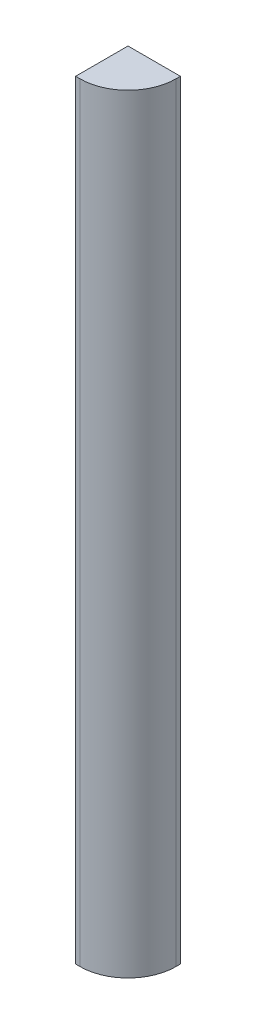
ISO-10303-21;
HEADER;
FILE_DESCRIPTION(('STEP AP214'),'2;1');
FILE_NAME('part.step','',(''),(''),'','','');
FILE_SCHEMA(('AUTOMOTIVE_DESIGN { 1 0 10303 214 1 1 1 1 }'));
ENDSEC;
DATA;
#1=APPLICATION_CONTEXT('core data for automotive mechanical design processes');
#2=APPLICATION_PROTOCOL_DEFINITION('international standard','automotive_design',2000,#1);
#3=PRODUCT_CONTEXT('',#1,'mechanical');
#4=PRODUCT('Part','Part','',(#3));
#5=PRODUCT_RELATED_PRODUCT_CATEGORY('part','',(#4));
#6=PRODUCT_DEFINITION_FORMATION('','',#4);
#7=PRODUCT_DEFINITION_CONTEXT('part definition',#1,'design');
#8=PRODUCT_DEFINITION('design','',#6,#7);
#9=PRODUCT_DEFINITION_SHAPE('','',#8);
#10=(LENGTH_UNIT() NAMED_UNIT(*) SI_UNIT(.MILLI.,.METRE.));
#11=(NAMED_UNIT(*) PLANE_ANGLE_UNIT() SI_UNIT($,.RADIAN.));
#12=(NAMED_UNIT(*) SI_UNIT($,.STERADIAN.) SOLID_ANGLE_UNIT());
#13=UNCERTAINTY_MEASURE_WITH_UNIT(LENGTH_MEASURE(1.E-05),#10,'distance_accuracy_value','');
#14=(GEOMETRIC_REPRESENTATION_CONTEXT(3) GLOBAL_UNCERTAINTY_ASSIGNED_CONTEXT((#13)) GLOBAL_UNIT_ASSIGNED_CONTEXT((#10,
#11,#12)) REPRESENTATION_CONTEXT('',''));
#15=CARTESIAN_POINT('',(0.,0.,0.));
#16=DIRECTION('',(0.,0.,1.));
#17=DIRECTION('',(1.,0.,0.));
#18=AXIS2_PLACEMENT_3D('',#15,#16,#17);
#19=CARTESIAN_POINT('',(-3.,87.99,-3.));
#20=DIRECTION('',(1.,0.,0.));
#21=DIRECTION('',(0.,0.,-1.));
#22=AXIS2_PLACEMENT_3D('',#19,#20,#21);
#23=PLANE('',#22);
#24=DIRECTION('',(0.,0.,1.));
#25=VECTOR('',#24,1.);
#26=CARTESIAN_POINT('',(-3.,0.,-3.));
#27=LINE('',#26,#25);
#28=CARTESIAN_POINT('',(-3.,0.,-3.));
#29=VERTEX_POINT('',#28);
#30=CARTESIAN_POINT('',(-3.,0.,3.));
#31=VERTEX_POINT('',#30);
#32=EDGE_CURVE('E106',#29,#31,#27,.T.);
#33=ORIENTED_EDGE('',*,*,#32,.T.);
#34=DIRECTION('',(0.,-1.,0.));
#35=VECTOR('',#34,1.);
#36=CARTESIAN_POINT('',(-3.,87.99,3.));
#37=LINE('',#36,#35);
#38=CARTESIAN_POINT('',(-3.,87.99,3.));
#39=VERTEX_POINT('',#38);
#40=EDGE_CURVE('E87',#39,#31,#37,.T.);
#41=ORIENTED_EDGE('',*,*,#40,.F.);
#42=DIRECTION('',(0.,0.,1.));
#43=VECTOR('',#42,1.);
#44=CARTESIAN_POINT('',(-3.,87.99,-3.));
#45=LINE('',#44,#43);
#46=CARTESIAN_POINT('',(-3.,87.99,-3.));
#47=VERTEX_POINT('',#46);
#48=EDGE_CURVE('E93',#47,#39,#45,.T.);
#49=ORIENTED_EDGE('',*,*,#48,.F.);
#50=DIRECTION('',(0.,-1.,0.));
#51=VECTOR('',#50,1.);
#52=CARTESIAN_POINT('',(-3.,87.99,-3.));
#53=LINE('',#52,#51);
#54=EDGE_CURVE('E116',#47,#29,#53,.T.);
#55=ORIENTED_EDGE('',*,*,#54,.T.);
#56=EDGE_LOOP('',(#33,#41,#49,#55));
#57=FACE_BOUND('',#56,.T.);
#58=ADVANCED_FACE('F39',(#57),#23,.F.);
#59=CARTESIAN_POINT('',(3.,87.99,3.));
#60=DIRECTION('',(0.,0.,-1.));
#61=DIRECTION('',(-1.,0.,0.));
#62=AXIS2_PLACEMENT_3D('',#59,#60,#61);
#63=PLANE('',#62);
#64=DIRECTION('',(1.,0.,0.));
#65=VECTOR('',#64,1.);
#66=CARTESIAN_POINT('',(3.,0.,3.));
#67=LINE('',#66,#65);
#68=CARTESIAN_POINT('',(-2.5,0.,3.));
#69=VERTEX_POINT('',#68);
#70=EDGE_CURVE('E129',#31,#69,#67,.T.);
#71=ORIENTED_EDGE('',*,*,#70,.T.);
#72=DIRECTION('',(0.,-1.,0.));
#73=VECTOR('',#72,1.);
#74=CARTESIAN_POINT('',(-2.5,87.99,3.));
#75=LINE('',#74,#73);
#76=CARTESIAN_POINT('',(-2.5,87.99,3.));
#77=VERTEX_POINT('',#76);
#78=EDGE_CURVE('E48',#69,#77,#75,.F.);
#79=ORIENTED_EDGE('',*,*,#78,.T.);
#80=DIRECTION('',(1.,0.,0.));
#81=VECTOR('',#80,1.);
#82=CARTESIAN_POINT('',(3.,87.99,3.));
#83=LINE('',#82,#81);
#84=EDGE_CURVE('E83',#39,#77,#83,.T.);
#85=ORIENTED_EDGE('',*,*,#84,.F.);
#86=ORIENTED_EDGE('',*,*,#40,.T.);
#87=EDGE_LOOP('',(#71,#79,#85,#86));
#88=FACE_BOUND('',#87,.T.);
#89=ADVANCED_FACE('F85',(#88),#63,.F.);
#90=CARTESIAN_POINT('',(3.,87.99,-3.));
#91=DIRECTION('',(-1.,0.,0.));
#92=DIRECTION('',(0.,0.,1.));
#93=AXIS2_PLACEMENT_3D('',#90,#91,#92);
#94=PLANE('',#93);
#95=DIRECTION('',(0.,0.,-1.));
#96=VECTOR('',#95,1.);
#97=CARTESIAN_POINT('',(3.,87.99,-3.));
#98=LINE('',#97,#96);
#99=CARTESIAN_POINT('',(3.,87.99,-2.5));
#100=VERTEX_POINT('',#99);
#101=CARTESIAN_POINT('',(3.,87.99,-3.));
#102=VERTEX_POINT('',#101);
#103=EDGE_CURVE('E92',#100,#102,#98,.T.);
#104=ORIENTED_EDGE('',*,*,#103,.F.);
#105=DIRECTION('',(0.,-1.,0.));
#106=VECTOR('',#105,1.);
#107=CARTESIAN_POINT('',(3.,87.99,-2.5));
#108=LINE('',#107,#106);
#109=CARTESIAN_POINT('',(3.,0.,-2.5));
#110=VERTEX_POINT('',#109);
#111=EDGE_CURVE('E108',#100,#110,#108,.T.);
#112=ORIENTED_EDGE('',*,*,#111,.T.);
#113=DIRECTION('',(0.,0.,-1.));
#114=VECTOR('',#113,1.);
#115=CARTESIAN_POINT('',(3.,0.,-3.));
#116=LINE('',#115,#114);
#117=CARTESIAN_POINT('',(3.,0.,-3.));
#118=VERTEX_POINT('',#117);
#119=EDGE_CURVE('E126',#110,#118,#116,.T.);
#120=ORIENTED_EDGE('',*,*,#119,.T.);
#121=DIRECTION('',(0.,-1.,0.));
#122=VECTOR('',#121,1.);
#123=CARTESIAN_POINT('',(3.,87.99,-3.));
#124=LINE('',#123,#122);
#125=EDGE_CURVE('E109',#102,#118,#124,.T.);
#126=ORIENTED_EDGE('',*,*,#125,.F.);
#127=EDGE_LOOP('',(#104,#112,#120,#126));
#128=FACE_BOUND('',#127,.T.);
#129=ADVANCED_FACE('F141',(#128),#94,.F.);
#130=CARTESIAN_POINT('',(3.,87.99,-3.));
#131=DIRECTION('',(0.,0.,1.));
#132=DIRECTION('',(1.,0.,0.));
#133=AXIS2_PLACEMENT_3D('',#130,#131,#132);
#134=PLANE('',#133);
#135=DIRECTION('',(-1.,0.,0.));
#136=VECTOR('',#135,1.);
#137=CARTESIAN_POINT('',(3.,0.,-3.));
#138=LINE('',#137,#136);
#139=EDGE_CURVE('E103',#118,#29,#138,.T.);
#140=ORIENTED_EDGE('',*,*,#139,.T.);
#141=ORIENTED_EDGE('',*,*,#54,.F.);
#142=DIRECTION('',(-1.,0.,0.));
#143=VECTOR('',#142,1.);
#144=CARTESIAN_POINT('',(3.,87.99,-3.));
#145=LINE('',#144,#143);
#146=EDGE_CURVE('E98',#102,#47,#145,.T.);
#147=ORIENTED_EDGE('',*,*,#146,.F.);
#148=ORIENTED_EDGE('',*,*,#125,.T.);
#149=EDGE_LOOP('',(#140,#141,#147,#148));
#150=FACE_BOUND('',#149,.T.);
#151=ADVANCED_FACE('F144',(#150),#134,.F.);
#152=CARTESIAN_POINT('',(0.,87.99,0.));
#153=DIRECTION('',(0.,-1.,0.));
#154=DIRECTION('',(0.,0.,-1.));
#155=AXIS2_PLACEMENT_3D('',#152,#153,#154);
#156=PLANE('',#155);
#157=ORIENTED_EDGE('',*,*,#84,.T.);
#158=CARTESIAN_POINT('',(-2.5,87.99,-2.5));
#159=DIRECTION('',(0.,-1.,0.));
#160=DIRECTION('',(0.,0.,-1.));
#161=AXIS2_PLACEMENT_3D('',#158,#159,#160);
#162=CIRCLE('',#161,5.5);
#163=EDGE_CURVE('E11',#77,#100,#162,.F.);
#164=ORIENTED_EDGE('',*,*,#163,.T.);
#165=ORIENTED_EDGE('',*,*,#103,.T.);
#166=ORIENTED_EDGE('',*,*,#146,.T.);
#167=ORIENTED_EDGE('',*,*,#48,.T.);
#168=EDGE_LOOP('',(#157,#164,#165,#166,#167));
#169=FACE_BOUND('',#168,.T.);
#170=ADVANCED_FACE('F96',(#169),#156,.F.);
#171=CARTESIAN_POINT('',(0.,0.,0.));
#172=DIRECTION('',(0.,-1.,0.));
#173=DIRECTION('',(0.,0.,-1.));
#174=AXIS2_PLACEMENT_3D('',#171,#172,#173);
#175=PLANE('',#174);
#176=ORIENTED_EDGE('',*,*,#119,.F.);
#177=CARTESIAN_POINT('',(-2.5,0.,-2.5));
#178=DIRECTION('',(0.,-1.,0.));
#179=DIRECTION('',(0.,0.,-1.));
#180=AXIS2_PLACEMENT_3D('',#177,#178,#179);
#181=CIRCLE('',#180,5.5);
#182=EDGE_CURVE('E62',#110,#69,#181,.T.);
#183=ORIENTED_EDGE('',*,*,#182,.T.);
#184=ORIENTED_EDGE('',*,*,#70,.F.);
#185=ORIENTED_EDGE('',*,*,#32,.F.);
#186=ORIENTED_EDGE('',*,*,#139,.F.);
#187=EDGE_LOOP('',(#176,#183,#184,#185,#186));
#188=FACE_BOUND('',#187,.T.);
#189=ADVANCED_FACE('F145',(#188),#175,.T.);
#190=CARTESIAN_POINT('',(-2.5,87.99,-2.5));
#191=DIRECTION('',(0.,-1.,0.));
#192=DIRECTION('',(0.,0.,-1.));
#193=AXIS2_PLACEMENT_3D('',#190,#191,#192);
#194=CYLINDRICAL_SURFACE('',#193,5.5);
#195=ORIENTED_EDGE('',*,*,#163,.F.);
#196=ORIENTED_EDGE('',*,*,#78,.F.);
#197=ORIENTED_EDGE('',*,*,#182,.F.);
#198=ORIENTED_EDGE('',*,*,#111,.F.);
#199=EDGE_LOOP('',(#195,#196,#197,#198));
#200=FACE_BOUND('',#199,.T.);
#201=ADVANCED_FACE('F41',(#200),#194,.T.);
#202=CLOSED_SHELL('',(#58,#89,#129,#151,#170,#189,#201));
#203=MANIFOLD_SOLID_BREP('B2',#202);
#204=ADVANCED_BREP_SHAPE_REPRESENTATION('',(#18,#203),#14);
#205=SHAPE_DEFINITION_REPRESENTATION(#9,#204);
ENDSEC;
END-ISO-10303-21;
